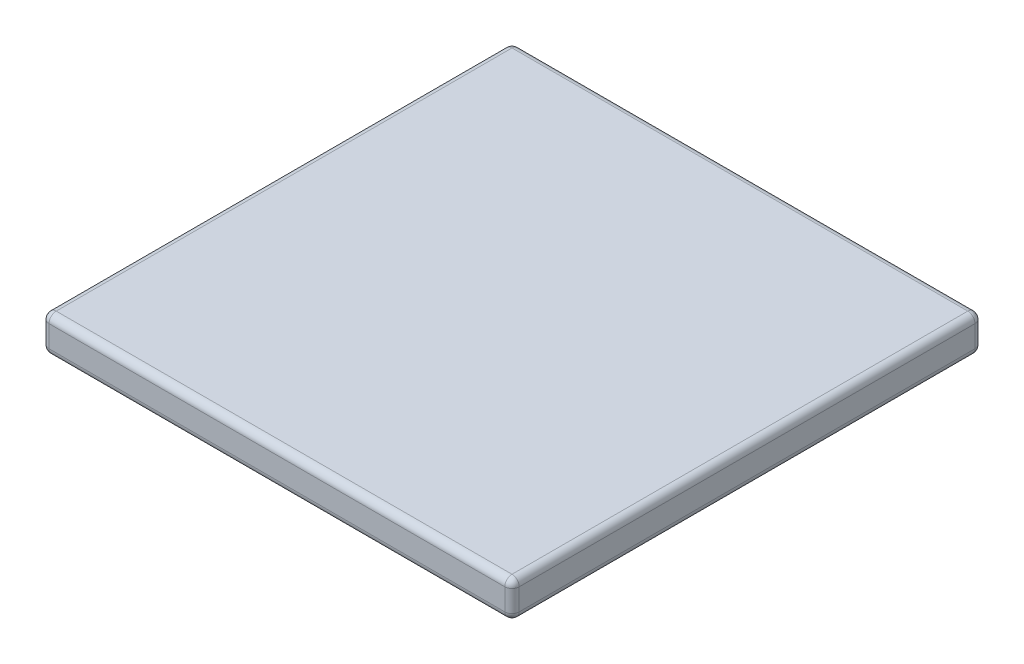
ISO-10303-21;
HEADER;
FILE_DESCRIPTION(('STEP AP214'),'2;1');
FILE_NAME('part.step','',(''),(''),'','','');
FILE_SCHEMA(('AUTOMOTIVE_DESIGN { 1 0 10303 214 1 1 1 1 }'));
ENDSEC;
DATA;
#1=APPLICATION_CONTEXT('core data for automotive mechanical design processes');
#2=APPLICATION_PROTOCOL_DEFINITION('international standard','automotive_design',2000,#1);
#3=PRODUCT_CONTEXT('',#1,'mechanical');
#4=PRODUCT('Part','Part','',(#3));
#5=PRODUCT_RELATED_PRODUCT_CATEGORY('part','',(#4));
#6=PRODUCT_DEFINITION_FORMATION('','',#4);
#7=PRODUCT_DEFINITION_CONTEXT('part definition',#1,'design');
#8=PRODUCT_DEFINITION('design','',#6,#7);
#9=PRODUCT_DEFINITION_SHAPE('','',#8);
#10=(LENGTH_UNIT() NAMED_UNIT(*) SI_UNIT(.MILLI.,.METRE.));
#11=(NAMED_UNIT(*) PLANE_ANGLE_UNIT() SI_UNIT($,.RADIAN.));
#12=(NAMED_UNIT(*) SI_UNIT($,.STERADIAN.) SOLID_ANGLE_UNIT());
#13=UNCERTAINTY_MEASURE_WITH_UNIT(LENGTH_MEASURE(1.E-05),#10,'distance_accuracy_value','');
#14=(GEOMETRIC_REPRESENTATION_CONTEXT(3) GLOBAL_UNCERTAINTY_ASSIGNED_CONTEXT((#13)) GLOBAL_UNIT_ASSIGNED_CONTEXT((#10,
#11,#12)) REPRESENTATION_CONTEXT('',''));
#15=CARTESIAN_POINT('',(0.,0.,0.));
#16=DIRECTION('',(0.,0.,1.));
#17=DIRECTION('',(1.,0.,0.));
#18=AXIS2_PLACEMENT_3D('',#15,#16,#17);
#19=CARTESIAN_POINT('',(-7.25,7.1,7.25));
#20=DIRECTION('',(0.,0.,-1.));
#21=DIRECTION('',(-1.,0.,0.));
#22=AXIS2_PLACEMENT_3D('',#19,#20,#21);
#23=PLANE('',#22);
#24=DIRECTION('',(1.,0.,0.));
#25=VECTOR('',#24,1.);
#26=CARTESIAN_POINT('',(-7.25,0.,7.25));
#27=LINE('',#26,#25);
#28=CARTESIAN_POINT('',(-7.25,0.,7.25));
#29=VERTEX_POINT('',#28);
#30=CARTESIAN_POINT('',(-5.75,0.,7.25));
#31=VERTEX_POINT('',#30);
#32=EDGE_CURVE('E191',#29,#31,#27,.T.);
#33=ORIENTED_EDGE('',*,*,#32,.T.);
#34=DIRECTION('',(0.,1.,0.));
#35=VECTOR('',#34,1.);
#36=CARTESIAN_POINT('',(-5.75,0.,7.25));
#37=LINE('',#36,#35);
#38=CARTESIAN_POINT('',(-5.75,7.1,7.25));
#39=VERTEX_POINT('',#38);
#40=EDGE_CURVE('E205',#31,#39,#37,.T.);
#41=ORIENTED_EDGE('',*,*,#40,.T.);
#42=DIRECTION('',(1.,0.,0.));
#43=VECTOR('',#42,1.);
#44=CARTESIAN_POINT('',(-7.25,7.1,7.25));
#45=LINE('',#44,#43);
#46=CARTESIAN_POINT('',(-7.25,7.1,7.25));
#47=VERTEX_POINT('',#46);
#48=EDGE_CURVE('E185',#47,#39,#45,.T.);
#49=ORIENTED_EDGE('',*,*,#48,.F.);
#50=DIRECTION('',(0.,-1.,0.));
#51=VECTOR('',#50,1.);
#52=CARTESIAN_POINT('',(-7.25,7.1,7.25));
#53=LINE('',#52,#51);
#54=EDGE_CURVE('E194',#47,#29,#53,.T.);
#55=ORIENTED_EDGE('',*,*,#54,.T.);
#56=EDGE_LOOP('',(#33,#41,#49,#55));
#57=FACE_BOUND('',#56,.T.);
#58=ADVANCED_FACE('F41',(#57),#23,.F.);
#59=CARTESIAN_POINT('',(-7.25,7.1,7.25));
#60=DIRECTION('',(-1.,0.,0.));
#61=DIRECTION('',(0.,0.,1.));
#62=AXIS2_PLACEMENT_3D('',#59,#60,#61);
#63=PLANE('',#62);
#64=DIRECTION('',(0.,0.,-1.));
#65=VECTOR('',#64,1.);
#66=CARTESIAN_POINT('',(-7.25,0.,7.25));
#67=LINE('',#66,#65);
#68=CARTESIAN_POINT('',(-7.25,0.,-7.25));
#69=VERTEX_POINT('',#68);
#70=EDGE_CURVE('E197',#29,#69,#67,.T.);
#71=ORIENTED_EDGE('',*,*,#70,.F.);
#72=ORIENTED_EDGE('',*,*,#54,.F.);
#73=DIRECTION('',(0.,0.,-1.));
#74=VECTOR('',#73,1.);
#75=CARTESIAN_POINT('',(-7.25,7.1,7.25));
#76=LINE('',#75,#74);
#77=CARTESIAN_POINT('',(-7.25,7.1,-7.25));
#78=VERTEX_POINT('',#77);
#79=EDGE_CURVE('E181',#47,#78,#76,.T.);
#80=ORIENTED_EDGE('',*,*,#79,.T.);
#81=DIRECTION('',(0.,-1.,0.));
#82=VECTOR('',#81,1.);
#83=CARTESIAN_POINT('',(-7.25,7.1,-7.25));
#84=LINE('',#83,#82);
#85=EDGE_CURVE('E206',#78,#69,#84,.T.);
#86=ORIENTED_EDGE('',*,*,#85,.T.);
#87=EDGE_LOOP('',(#71,#72,#80,#86));
#88=FACE_BOUND('',#87,.T.);
#89=ADVANCED_FACE('F195',(#88),#63,.T.);
#90=CARTESIAN_POINT('',(5.75,7.1,7.25));
#91=VERTEX_POINT('',#90);
#92=CARTESIAN_POINT('',(7.25,7.1,7.25));
#93=VERTEX_POINT('',#92);
#94=EDGE_CURVE('E207',#91,#93,#45,.T.);
#95=ORIENTED_EDGE('',*,*,#94,.F.);
#96=DIRECTION('',(0.,1.,0.));
#97=VECTOR('',#96,1.);
#98=CARTESIAN_POINT('',(5.75,0.,7.25));
#99=LINE('',#98,#97);
#100=CARTESIAN_POINT('',(5.75,0.,7.25));
#101=VERTEX_POINT('',#100);
#102=EDGE_CURVE('E457',#101,#91,#99,.T.);
#103=ORIENTED_EDGE('',*,*,#102,.F.);
#104=CARTESIAN_POINT('',(7.25,0.,7.25));
#105=VERTEX_POINT('',#104);
#106=EDGE_CURVE('E223',#101,#105,#27,.T.);
#107=ORIENTED_EDGE('',*,*,#106,.T.);
#108=DIRECTION('',(0.,-1.,0.));
#109=VECTOR('',#108,1.);
#110=CARTESIAN_POINT('',(7.25,7.1,7.25));
#111=LINE('',#110,#109);
#112=EDGE_CURVE('E202',#93,#105,#111,.T.);
#113=ORIENTED_EDGE('',*,*,#112,.F.);
#114=EDGE_LOOP('',(#95,#103,#107,#113));
#115=FACE_BOUND('',#114,.T.);
#116=ADVANCED_FACE('F438',(#115),#23,.F.);
#117=CARTESIAN_POINT('',(7.25,7.1,7.25));
#118=DIRECTION('',(-1.,0.,0.));
#119=DIRECTION('',(0.,0.,1.));
#120=AXIS2_PLACEMENT_3D('',#117,#118,#119);
#121=PLANE('',#120);
#122=DIRECTION('',(0.,0.,-1.));
#123=VECTOR('',#122,1.);
#124=CARTESIAN_POINT('',(7.25,0.,7.25));
#125=LINE('',#124,#123);
#126=CARTESIAN_POINT('',(7.25,0.,-7.25));
#127=VERTEX_POINT('',#126);
#128=EDGE_CURVE('E220',#105,#127,#125,.T.);
#129=ORIENTED_EDGE('',*,*,#128,.T.);
#130=DIRECTION('',(0.,-1.,0.));
#131=VECTOR('',#130,1.);
#132=CARTESIAN_POINT('',(7.25,7.1,-7.25));
#133=LINE('',#132,#131);
#134=CARTESIAN_POINT('',(7.25,7.1,-7.25));
#135=VERTEX_POINT('',#134);
#136=EDGE_CURVE('E209',#135,#127,#133,.T.);
#137=ORIENTED_EDGE('',*,*,#136,.F.);
#138=DIRECTION('',(0.,0.,-1.));
#139=VECTOR('',#138,1.);
#140=CARTESIAN_POINT('',(7.25,7.1,7.25));
#141=LINE('',#140,#139);
#142=EDGE_CURVE('E211',#93,#135,#141,.T.);
#143=ORIENTED_EDGE('',*,*,#142,.F.);
#144=ORIENTED_EDGE('',*,*,#112,.T.);
#145=EDGE_LOOP('',(#129,#137,#143,#144));
#146=FACE_BOUND('',#145,.T.);
#147=ADVANCED_FACE('F446',(#146),#121,.F.);
#148=CARTESIAN_POINT('',(-7.25,7.1,-7.25));
#149=DIRECTION('',(0.,0.,-1.));
#150=DIRECTION('',(-1.,0.,0.));
#151=AXIS2_PLACEMENT_3D('',#148,#149,#150);
#152=PLANE('',#151);
#153=DIRECTION('',(1.,0.,0.));
#154=VECTOR('',#153,1.);
#155=CARTESIAN_POINT('',(-7.25,0.,-7.25));
#156=LINE('',#155,#154);
#157=EDGE_CURVE('E216',#69,#127,#156,.T.);
#158=ORIENTED_EDGE('',*,*,#157,.F.);
#159=ORIENTED_EDGE('',*,*,#85,.F.);
#160=DIRECTION('',(1.,0.,0.));
#161=VECTOR('',#160,1.);
#162=CARTESIAN_POINT('',(-7.25,7.1,-7.25));
#163=LINE('',#162,#161);
#164=EDGE_CURVE('E188',#78,#135,#163,.T.);
#165=ORIENTED_EDGE('',*,*,#164,.T.);
#166=ORIENTED_EDGE('',*,*,#136,.T.);
#167=EDGE_LOOP('',(#158,#159,#165,#166));
#168=FACE_BOUND('',#167,.T.);
#169=ADVANCED_FACE('F451',(#168),#152,.T.);
#170=CARTESIAN_POINT('',(0.,0.,0.));
#171=DIRECTION('',(0.,-1.,0.));
#172=DIRECTION('',(0.,0.,-1.));
#173=AXIS2_PLACEMENT_3D('',#170,#171,#172);
#174=PLANE('',#173);
#175=CARTESIAN_POINT('',(0.,0.,-1.));
#176=DIRECTION('',(0.,-1.,0.));
#177=DIRECTION('',(0.,0.,-1.));
#178=AXIS2_PLACEMENT_3D('',#175,#176,#177);
#179=CIRCLE('',#178,4.7625);
#180=CARTESIAN_POINT('',(0.,0.,-5.7625));
#181=VERTEX_POINT('',#180);
#182=EDGE_CURVE('E320',#181,#181,#179,.T.);
#183=ORIENTED_EDGE('',*,*,#182,.F.);
#184=EDGE_LOOP('',(#183));
#185=FACE_BOUND('',#184,.T.);
#186=DIRECTION('',(0.,0.,1.));
#187=VECTOR('',#186,1.);
#188=CARTESIAN_POINT('',(-5.75,0.,7.25));
#189=LINE('',#188,#187);
#190=CARTESIAN_POINT('',(-5.75,0.,5.25));
#191=VERTEX_POINT('',#190);
#192=EDGE_CURVE('E487',#191,#31,#189,.T.);
#193=ORIENTED_EDGE('',*,*,#192,.T.);
#194=ORIENTED_EDGE('',*,*,#32,.F.);
#195=ORIENTED_EDGE('',*,*,#70,.T.);
#196=ORIENTED_EDGE('',*,*,#157,.T.);
#197=ORIENTED_EDGE('',*,*,#128,.F.);
#198=ORIENTED_EDGE('',*,*,#106,.F.);
#199=DIRECTION('',(0.,0.,-1.));
#200=VECTOR('',#199,1.);
#201=CARTESIAN_POINT('',(5.75,0.,7.25));
#202=LINE('',#201,#200);
#203=CARTESIAN_POINT('',(5.75,0.,5.25));
#204=VERTEX_POINT('',#203);
#205=EDGE_CURVE('E472',#101,#204,#202,.T.);
#206=ORIENTED_EDGE('',*,*,#205,.T.);
#207=DIRECTION('',(-1.,0.,0.));
#208=VECTOR('',#207,1.);
#209=CARTESIAN_POINT('',(-5.75,0.,5.25));
#210=LINE('',#209,#208);
#211=EDGE_CURVE('E476',#204,#191,#210,.T.);
#212=ORIENTED_EDGE('',*,*,#211,.T.);
#213=EDGE_LOOP('',(#193,#194,#195,#196,#197,#198,#206,#212));
#214=FACE_BOUND('',#213,.T.);
#215=ADVANCED_FACE('F484',(#185,#214),#174,.T.);
#216=CARTESIAN_POINT('',(-5.75,0.,7.25));
#217=DIRECTION('',(-1.,0.,0.));
#218=DIRECTION('',(0.,0.,1.));
#219=AXIS2_PLACEMENT_3D('',#216,#217,#218);
#220=PLANE('',#219);
#221=DIRECTION('',(0.,0.,1.));
#222=VECTOR('',#221,1.);
#223=CARTESIAN_POINT('',(-5.75,7.1,7.25));
#224=LINE('',#223,#222);
#225=CARTESIAN_POINT('',(-5.75,7.1,5.25));
#226=VERTEX_POINT('',#225);
#227=EDGE_CURVE('E468',#226,#39,#224,.T.);
#228=ORIENTED_EDGE('',*,*,#227,.T.);
#229=ORIENTED_EDGE('',*,*,#40,.F.);
#230=ORIENTED_EDGE('',*,*,#192,.F.);
#231=DIRECTION('',(0.,1.,0.));
#232=VECTOR('',#231,1.);
#233=CARTESIAN_POINT('',(-5.75,0.,5.25));
#234=LINE('',#233,#232);
#235=EDGE_CURVE('E217',#191,#226,#234,.T.);
#236=ORIENTED_EDGE('',*,*,#235,.T.);
#237=EDGE_LOOP('',(#228,#229,#230,#236));
#238=FACE_BOUND('',#237,.T.);
#239=ADVANCED_FACE('F498',(#238),#220,.F.);
#240=CARTESIAN_POINT('',(-5.75,0.,5.25));
#241=DIRECTION('',(0.,0.,-1.));
#242=DIRECTION('',(-1.,0.,0.));
#243=AXIS2_PLACEMENT_3D('',#240,#241,#242);
#244=PLANE('',#243);
#245=DIRECTION('',(-1.,0.,0.));
#246=VECTOR('',#245,1.);
#247=CARTESIAN_POINT('',(-5.75,7.1,5.25));
#248=LINE('',#247,#246);
#249=CARTESIAN_POINT('',(5.75,7.1,5.25));
#250=VERTEX_POINT('',#249);
#251=EDGE_CURVE('E464',#250,#226,#248,.T.);
#252=ORIENTED_EDGE('',*,*,#251,.T.);
#253=ORIENTED_EDGE('',*,*,#235,.F.);
#254=ORIENTED_EDGE('',*,*,#211,.F.);
#255=DIRECTION('',(0.,1.,0.));
#256=VECTOR('',#255,1.);
#257=CARTESIAN_POINT('',(5.75,0.,5.25));
#258=LINE('',#257,#256);
#259=EDGE_CURVE('E473',#204,#250,#258,.T.);
#260=ORIENTED_EDGE('',*,*,#259,.T.);
#261=EDGE_LOOP('',(#252,#253,#254,#260));
#262=FACE_BOUND('',#261,.T.);
#263=ADVANCED_FACE('F500',(#262),#244,.F.);
#264=CARTESIAN_POINT('',(5.75,0.,7.25));
#265=DIRECTION('',(1.,0.,0.));
#266=DIRECTION('',(0.,0.,-1.));
#267=AXIS2_PLACEMENT_3D('',#264,#265,#266);
#268=PLANE('',#267);
#269=DIRECTION('',(0.,0.,-1.));
#270=VECTOR('',#269,1.);
#271=CARTESIAN_POINT('',(5.75,7.1,7.25));
#272=LINE('',#271,#270);
#273=EDGE_CURVE('E462',#91,#250,#272,.T.);
#274=ORIENTED_EDGE('',*,*,#273,.T.);
#275=ORIENTED_EDGE('',*,*,#259,.F.);
#276=ORIENTED_EDGE('',*,*,#205,.F.);
#277=ORIENTED_EDGE('',*,*,#102,.T.);
#278=EDGE_LOOP('',(#274,#275,#276,#277));
#279=FACE_BOUND('',#278,.T.);
#280=ADVANCED_FACE('F470',(#279),#268,.F.);
#281=CARTESIAN_POINT('',(0.,-1.,-1.));
#282=DIRECTION('',(0.,1.,0.));
#283=DIRECTION('',(0.,0.,1.));
#284=AXIS2_PLACEMENT_3D('',#281,#282,#283);
#285=CYLINDRICAL_SURFACE('',#284,4.7625);
#286=CARTESIAN_POINT('',(0.,-1.,-1.));
#287=DIRECTION('',(0.,-1.,0.));
#288=DIRECTION('',(0.,0.,-1.));
#289=AXIS2_PLACEMENT_3D('',#286,#287,#288);
#290=CIRCLE('',#289,4.7625);
#291=CARTESIAN_POINT('',(0.,-1.,-5.7625));
#292=VERTEX_POINT('',#291);
#293=EDGE_CURVE('E497',#292,#292,#290,.T.);
#294=ORIENTED_EDGE('',*,*,#293,.F.);
#295=EDGE_LOOP('',(#294));
#296=FACE_BOUND('',#295,.T.);
#297=ORIENTED_EDGE('',*,*,#182,.T.);
#298=EDGE_LOOP('',(#297));
#299=FACE_BOUND('',#298,.T.);
#300=ADVANCED_FACE('F507',(#296,#299),#285,.T.);
#301=CARTESIAN_POINT('',(0.,-1.,-1.));
#302=DIRECTION('',(0.,-1.,0.));
#303=DIRECTION('',(0.,0.,-1.));
#304=AXIS2_PLACEMENT_3D('',#301,#302,#303);
#305=PLANE('',#304);
#306=ORIENTED_EDGE('',*,*,#293,.T.);
#307=EDGE_LOOP('',(#306));
#308=FACE_BOUND('',#307,.T.);
#309=ADVANCED_FACE('F524',(#308),#305,.T.);
#310=CARTESIAN_POINT('',(32.5,12.1,32.5));
#311=DIRECTION('',(-1.,0.,0.));
#312=DIRECTION('',(0.,0.,1.));
#313=AXIS2_PLACEMENT_3D('',#310,#311,#312);
#314=PLANE('',#313);
#315=DIRECTION('',(0.,-1.,0.));
#316=VECTOR('',#315,1.);
#317=CARTESIAN_POINT('',(32.5,12.1,-31.5));
#318=LINE('',#317,#316);
#319=CARTESIAN_POINT('',(32.5,8.1,-31.5));
#320=VERTEX_POINT('',#319);
#321=CARTESIAN_POINT('',(32.5,11.1,-31.5));
#322=VERTEX_POINT('',#321);
#323=EDGE_CURVE('E248',#320,#322,#318,.F.);
#324=ORIENTED_EDGE('',*,*,#323,.T.);
#325=DIRECTION('',(0.,0.,-1.));
#326=VECTOR('',#325,1.);
#327=CARTESIAN_POINT('',(32.5,11.1,32.5));
#328=LINE('',#327,#326);
#329=CARTESIAN_POINT('',(32.5,11.1,31.5));
#330=VERTEX_POINT('',#329);
#331=EDGE_CURVE('E284',#322,#330,#328,.F.);
#332=ORIENTED_EDGE('',*,*,#331,.T.);
#333=DIRECTION('',(0.,-1.,0.));
#334=VECTOR('',#333,1.);
#335=CARTESIAN_POINT('',(32.5,12.1,31.5));
#336=LINE('',#335,#334);
#337=CARTESIAN_POINT('',(32.5,8.1,31.5));
#338=VERTEX_POINT('',#337);
#339=EDGE_CURVE('E245',#330,#338,#336,.T.);
#340=ORIENTED_EDGE('',*,*,#339,.T.);
#341=DIRECTION('',(0.,0.,-1.));
#342=VECTOR('',#341,1.);
#343=CARTESIAN_POINT('',(32.5,8.1,-31.5));
#344=LINE('',#343,#342);
#345=EDGE_CURVE('E282',#338,#320,#344,.T.);
#346=ORIENTED_EDGE('',*,*,#345,.T.);
#347=EDGE_LOOP('',(#324,#332,#340,#346));
#348=FACE_BOUND('',#347,.T.);
#349=ADVANCED_FACE('F382',(#348),#314,.F.);
#350=CARTESIAN_POINT('',(-32.5,12.1,-32.5));
#351=DIRECTION('',(0.,0.,1.));
#352=DIRECTION('',(1.,0.,0.));
#353=AXIS2_PLACEMENT_3D('',#350,#351,#352);
#354=PLANE('',#353);
#355=DIRECTION('',(0.,-1.,0.));
#356=VECTOR('',#355,1.);
#357=CARTESIAN_POINT('',(-31.5,12.1,-32.5));
#358=LINE('',#357,#356);
#359=CARTESIAN_POINT('',(-31.5,8.1,-32.5));
#360=VERTEX_POINT('',#359);
#361=CARTESIAN_POINT('',(-31.5,11.1,-32.5));
#362=VERTEX_POINT('',#361);
#363=EDGE_CURVE('E242',#360,#362,#358,.F.);
#364=ORIENTED_EDGE('',*,*,#363,.T.);
#365=DIRECTION('',(-1.,0.,0.));
#366=VECTOR('',#365,1.);
#367=CARTESIAN_POINT('',(-32.5,11.1,-32.5));
#368=LINE('',#367,#366);
#369=CARTESIAN_POINT('',(31.5,11.1,-32.5));
#370=VERTEX_POINT('',#369);
#371=EDGE_CURVE('E276',#362,#370,#368,.F.);
#372=ORIENTED_EDGE('',*,*,#371,.T.);
#373=DIRECTION('',(0.,-1.,0.));
#374=VECTOR('',#373,1.);
#375=CARTESIAN_POINT('',(31.5,12.1,-32.5));
#376=LINE('',#375,#374);
#377=CARTESIAN_POINT('',(31.5,8.1,-32.5));
#378=VERTEX_POINT('',#377);
#379=EDGE_CURVE('E239',#370,#378,#376,.T.);
#380=ORIENTED_EDGE('',*,*,#379,.T.);
#381=DIRECTION('',(-1.,0.,0.));
#382=VECTOR('',#381,1.);
#383=CARTESIAN_POINT('',(-31.5,8.1,-32.5));
#384=LINE('',#383,#382);
#385=EDGE_CURVE('E274',#378,#360,#384,.T.);
#386=ORIENTED_EDGE('',*,*,#385,.T.);
#387=EDGE_LOOP('',(#364,#372,#380,#386));
#388=FACE_BOUND('',#387,.T.);
#389=ADVANCED_FACE('F353',(#388),#354,.F.);
#390=CARTESIAN_POINT('',(-32.5,12.1,32.5));
#391=DIRECTION('',(1.,0.,0.));
#392=DIRECTION('',(0.,0.,-1.));
#393=AXIS2_PLACEMENT_3D('',#390,#391,#392);
#394=PLANE('',#393);
#395=DIRECTION('',(0.,-1.,0.));
#396=VECTOR('',#395,1.);
#397=CARTESIAN_POINT('',(-32.5,12.1,31.5));
#398=LINE('',#397,#396);
#399=CARTESIAN_POINT('',(-32.5,8.1,31.5));
#400=VERTEX_POINT('',#399);
#401=CARTESIAN_POINT('',(-32.5,11.1,31.5));
#402=VERTEX_POINT('',#401);
#403=EDGE_CURVE('E236',#400,#402,#398,.F.);
#404=ORIENTED_EDGE('',*,*,#403,.T.);
#405=DIRECTION('',(0.,0.,1.));
#406=VECTOR('',#405,1.);
#407=CARTESIAN_POINT('',(-32.5,11.1,32.5));
#408=LINE('',#407,#406);
#409=CARTESIAN_POINT('',(-32.5,11.1,-31.5));
#410=VERTEX_POINT('',#409);
#411=EDGE_CURVE('E268',#402,#410,#408,.F.);
#412=ORIENTED_EDGE('',*,*,#411,.T.);
#413=DIRECTION('',(0.,-1.,0.));
#414=VECTOR('',#413,1.);
#415=CARTESIAN_POINT('',(-32.5,12.1,-31.5));
#416=LINE('',#415,#414);
#417=CARTESIAN_POINT('',(-32.5,8.1,-31.5));
#418=VERTEX_POINT('',#417);
#419=EDGE_CURVE('E233',#410,#418,#416,.T.);
#420=ORIENTED_EDGE('',*,*,#419,.T.);
#421=DIRECTION('',(0.,0.,1.));
#422=VECTOR('',#421,1.);
#423=CARTESIAN_POINT('',(-32.5,8.1,31.5));
#424=LINE('',#423,#422);
#425=EDGE_CURVE('E266',#418,#400,#424,.T.);
#426=ORIENTED_EDGE('',*,*,#425,.T.);
#427=EDGE_LOOP('',(#404,#412,#420,#426));
#428=FACE_BOUND('',#427,.T.);
#429=ADVANCED_FACE('F408',(#428),#394,.F.);
#430=CARTESIAN_POINT('',(-32.5,12.1,32.5));
#431=DIRECTION('',(0.,0.,-1.));
#432=DIRECTION('',(-1.,0.,0.));
#433=AXIS2_PLACEMENT_3D('',#430,#431,#432);
#434=PLANE('',#433);
#435=DIRECTION('',(0.,-1.,0.));
#436=VECTOR('',#435,1.);
#437=CARTESIAN_POINT('',(31.5,12.1,32.5));
#438=LINE('',#437,#436);
#439=CARTESIAN_POINT('',(31.5,8.1,32.5));
#440=VERTEX_POINT('',#439);
#441=CARTESIAN_POINT('',(31.5,11.1,32.5));
#442=VERTEX_POINT('',#441);
#443=EDGE_CURVE('E201',#440,#442,#438,.F.);
#444=ORIENTED_EDGE('',*,*,#443,.T.);
#445=DIRECTION('',(1.,0.,0.));
#446=VECTOR('',#445,1.);
#447=CARTESIAN_POINT('',(-32.5,11.1,32.5));
#448=LINE('',#447,#446);
#449=CARTESIAN_POINT('',(-31.5,11.1,32.5));
#450=VERTEX_POINT('',#449);
#451=EDGE_CURVE('E11',#442,#450,#448,.F.);
#452=ORIENTED_EDGE('',*,*,#451,.T.);
#453=DIRECTION('',(0.,-1.,0.));
#454=VECTOR('',#453,1.);
#455=CARTESIAN_POINT('',(-31.5,12.1,32.5));
#456=LINE('',#455,#454);
#457=CARTESIAN_POINT('',(-31.5,8.1,32.5));
#458=VERTEX_POINT('',#457);
#459=EDGE_CURVE('E230',#450,#458,#456,.T.);
#460=ORIENTED_EDGE('',*,*,#459,.T.);
#461=DIRECTION('',(1.,0.,0.));
#462=VECTOR('',#461,1.);
#463=CARTESIAN_POINT('',(31.5,8.1,32.5));
#464=LINE('',#463,#462);
#465=EDGE_CURVE('E50',#458,#440,#464,.T.);
#466=ORIENTED_EDGE('',*,*,#465,.T.);
#467=EDGE_LOOP('',(#444,#452,#460,#466));
#468=FACE_BOUND('',#467,.T.);
#469=ADVANCED_FACE('F398',(#468),#434,.F.);
#470=CARTESIAN_POINT('',(0.,12.1,0.));
#471=DIRECTION('',(0.,-1.,0.));
#472=DIRECTION('',(0.,0.,-1.));
#473=AXIS2_PLACEMENT_3D('',#470,#471,#472);
#474=PLANE('',#473);
#475=DIRECTION('',(-1.,0.,0.));
#476=VECTOR('',#475,1.);
#477=CARTESIAN_POINT('',(0.,12.1,-31.5));
#478=LINE('',#477,#476);
#479=CARTESIAN_POINT('',(31.5,12.1,-31.5));
#480=VERTEX_POINT('',#479);
#481=CARTESIAN_POINT('',(-31.5,12.1,-31.5));
#482=VERTEX_POINT('',#481);
#483=EDGE_CURVE('E261',#480,#482,#478,.T.);
#484=ORIENTED_EDGE('',*,*,#483,.T.);
#485=DIRECTION('',(0.,0.,1.));
#486=VECTOR('',#485,1.);
#487=CARTESIAN_POINT('',(-31.5,12.1,0.));
#488=LINE('',#487,#486);
#489=CARTESIAN_POINT('',(-31.5,12.1,31.5));
#490=VERTEX_POINT('',#489);
#491=EDGE_CURVE('E263',#482,#490,#488,.T.);
#492=ORIENTED_EDGE('',*,*,#491,.T.);
#493=DIRECTION('',(1.,0.,0.));
#494=VECTOR('',#493,1.);
#495=CARTESIAN_POINT('',(0.,12.1,31.5));
#496=LINE('',#495,#494);
#497=CARTESIAN_POINT('',(31.5,12.1,31.5));
#498=VERTEX_POINT('',#497);
#499=EDGE_CURVE('E257',#490,#498,#496,.T.);
#500=ORIENTED_EDGE('',*,*,#499,.T.);
#501=DIRECTION('',(0.,0.,-1.));
#502=VECTOR('',#501,1.);
#503=CARTESIAN_POINT('',(31.5,12.1,0.));
#504=LINE('',#503,#502);
#505=EDGE_CURVE('E259',#498,#480,#504,.T.);
#506=ORIENTED_EDGE('',*,*,#505,.T.);
#507=EDGE_LOOP('',(#484,#492,#500,#506));
#508=FACE_BOUND('',#507,.T.);
#509=ADVANCED_FACE('F372',(#508),#474,.F.);
#510=CARTESIAN_POINT('',(0.,7.1,0.));
#511=DIRECTION('',(0.,-1.,0.));
#512=DIRECTION('',(0.,0.,-1.));
#513=AXIS2_PLACEMENT_3D('',#510,#511,#512);
#514=PLANE('',#513);
#515=DIRECTION('',(1.,0.,0.));
#516=VECTOR('',#515,1.);
#517=CARTESIAN_POINT('',(-31.5,7.1,31.5));
#518=LINE('',#517,#516);
#519=CARTESIAN_POINT('',(31.5,7.1,31.5));
#520=VERTEX_POINT('',#519);
#521=CARTESIAN_POINT('',(-31.5,7.1,31.5));
#522=VERTEX_POINT('',#521);
#523=EDGE_CURVE('E290',#520,#522,#518,.F.);
#524=ORIENTED_EDGE('',*,*,#523,.T.);
#525=DIRECTION('',(0.,0.,1.));
#526=VECTOR('',#525,1.);
#527=CARTESIAN_POINT('',(-31.5,7.1,-31.5));
#528=LINE('',#527,#526);
#529=CARTESIAN_POINT('',(-31.5,7.1,-31.5));
#530=VERTEX_POINT('',#529);
#531=EDGE_CURVE('E295',#522,#530,#528,.F.);
#532=ORIENTED_EDGE('',*,*,#531,.T.);
#533=DIRECTION('',(-1.,0.,0.));
#534=VECTOR('',#533,1.);
#535=CARTESIAN_POINT('',(31.5,7.1,-31.5));
#536=LINE('',#535,#534);
#537=CARTESIAN_POINT('',(31.5,7.1,-31.5));
#538=VERTEX_POINT('',#537);
#539=EDGE_CURVE('E66',#530,#538,#536,.F.);
#540=ORIENTED_EDGE('',*,*,#539,.T.);
#541=DIRECTION('',(0.,0.,-1.));
#542=VECTOR('',#541,1.);
#543=CARTESIAN_POINT('',(31.5,7.1,31.5));
#544=LINE('',#543,#542);
#545=EDGE_CURVE('E292',#538,#520,#544,.F.);
#546=ORIENTED_EDGE('',*,*,#545,.T.);
#547=EDGE_LOOP('',(#524,#532,#540,#546));
#548=FACE_BOUND('',#547,.T.);
#549=ORIENTED_EDGE('',*,*,#79,.F.);
#550=ORIENTED_EDGE('',*,*,#48,.T.);
#551=ORIENTED_EDGE('',*,*,#227,.F.);
#552=ORIENTED_EDGE('',*,*,#251,.F.);
#553=ORIENTED_EDGE('',*,*,#273,.F.);
#554=ORIENTED_EDGE('',*,*,#94,.T.);
#555=ORIENTED_EDGE('',*,*,#142,.T.);
#556=ORIENTED_EDGE('',*,*,#164,.F.);
#557=EDGE_LOOP('',(#549,#550,#551,#552,#553,#554,#555,#556));
#558=FACE_BOUND('',#557,.T.);
#559=ADVANCED_FACE('F183',(#548,#558),#514,.T.);
#560=CARTESIAN_POINT('',(-31.5,12.1,31.5));
#561=DIRECTION('',(0.,-1.,0.));
#562=DIRECTION('',(0.,0.,-1.));
#563=AXIS2_PLACEMENT_3D('',#560,#561,#562);
#564=CYLINDRICAL_SURFACE('',#563,1.);
#565=ORIENTED_EDGE('',*,*,#459,.F.);
#566=CARTESIAN_POINT('',(-31.5,11.1,31.5));
#567=DIRECTION('',(0.,-1.,0.));
#568=DIRECTION('',(0.,0.,-1.));
#569=AXIS2_PLACEMENT_3D('',#566,#567,#568);
#570=CIRCLE('',#569,1.);
#571=EDGE_CURVE('E254',#450,#402,#570,.T.);
#572=ORIENTED_EDGE('',*,*,#571,.T.);
#573=ORIENTED_EDGE('',*,*,#403,.F.);
#574=CARTESIAN_POINT('',(-31.5,8.1,31.5));
#575=DIRECTION('',(0.,-1.,0.));
#576=DIRECTION('',(0.,0.,-1.));
#577=AXIS2_PLACEMENT_3D('',#574,#575,#576);
#578=CIRCLE('',#577,1.);
#579=EDGE_CURVE('E251',#400,#458,#578,.F.);
#580=ORIENTED_EDGE('',*,*,#579,.T.);
#581=EDGE_LOOP('',(#565,#572,#573,#580));
#582=FACE_BOUND('',#581,.T.);
#583=ADVANCED_FACE('F401',(#582),#564,.T.);
#584=CARTESIAN_POINT('',(-31.5,12.1,-31.5));
#585=DIRECTION('',(0.,-1.,0.));
#586=DIRECTION('',(0.,0.,-1.));
#587=AXIS2_PLACEMENT_3D('',#584,#585,#586);
#588=CYLINDRICAL_SURFACE('',#587,1.);
#589=ORIENTED_EDGE('',*,*,#419,.F.);
#590=CARTESIAN_POINT('',(-31.5,11.1,-31.5));
#591=DIRECTION('',(0.,-1.,0.));
#592=DIRECTION('',(0.,0.,-1.));
#593=AXIS2_PLACEMENT_3D('',#590,#591,#592);
#594=CIRCLE('',#593,1.);
#595=EDGE_CURVE('E272',#410,#362,#594,.T.);
#596=ORIENTED_EDGE('',*,*,#595,.T.);
#597=ORIENTED_EDGE('',*,*,#363,.F.);
#598=CARTESIAN_POINT('',(-31.5,8.1,-31.5));
#599=DIRECTION('',(0.,-1.,0.));
#600=DIRECTION('',(0.,0.,-1.));
#601=AXIS2_PLACEMENT_3D('',#598,#599,#600);
#602=CIRCLE('',#601,1.);
#603=EDGE_CURVE('E270',#360,#418,#602,.F.);
#604=ORIENTED_EDGE('',*,*,#603,.T.);
#605=EDGE_LOOP('',(#589,#596,#597,#604));
#606=FACE_BOUND('',#605,.T.);
#607=ADVANCED_FACE('F410',(#606),#588,.T.);
#608=CARTESIAN_POINT('',(31.5,12.1,-31.5));
#609=DIRECTION('',(0.,-1.,0.));
#610=DIRECTION('',(0.,0.,-1.));
#611=AXIS2_PLACEMENT_3D('',#608,#609,#610);
#612=CYLINDRICAL_SURFACE('',#611,1.);
#613=ORIENTED_EDGE('',*,*,#379,.F.);
#614=CARTESIAN_POINT('',(31.5,11.1,-31.5));
#615=DIRECTION('',(0.,-1.,0.));
#616=DIRECTION('',(0.,0.,-1.));
#617=AXIS2_PLACEMENT_3D('',#614,#615,#616);
#618=CIRCLE('',#617,1.);
#619=EDGE_CURVE('E280',#370,#322,#618,.T.);
#620=ORIENTED_EDGE('',*,*,#619,.T.);
#621=ORIENTED_EDGE('',*,*,#323,.F.);
#622=CARTESIAN_POINT('',(31.5,8.1,-31.5));
#623=DIRECTION('',(0.,-1.,0.));
#624=DIRECTION('',(0.,0.,-1.));
#625=AXIS2_PLACEMENT_3D('',#622,#623,#624);
#626=CIRCLE('',#625,1.);
#627=EDGE_CURVE('E278',#320,#378,#626,.F.);
#628=ORIENTED_EDGE('',*,*,#627,.T.);
#629=EDGE_LOOP('',(#613,#620,#621,#628));
#630=FACE_BOUND('',#629,.T.);
#631=ADVANCED_FACE('F350',(#630),#612,.T.);
#632=CARTESIAN_POINT('',(31.5,12.1,31.5));
#633=DIRECTION('',(0.,-1.,0.));
#634=DIRECTION('',(0.,0.,-1.));
#635=AXIS2_PLACEMENT_3D('',#632,#633,#634);
#636=CYLINDRICAL_SURFACE('',#635,1.);
#637=ORIENTED_EDGE('',*,*,#339,.F.);
#638=CARTESIAN_POINT('',(31.5,11.1,31.5));
#639=DIRECTION('',(0.,-1.,0.));
#640=DIRECTION('',(0.,0.,-1.));
#641=AXIS2_PLACEMENT_3D('',#638,#639,#640);
#642=CIRCLE('',#641,1.);
#643=EDGE_CURVE('E288',#330,#442,#642,.T.);
#644=ORIENTED_EDGE('',*,*,#643,.T.);
#645=ORIENTED_EDGE('',*,*,#443,.F.);
#646=CARTESIAN_POINT('',(31.5,8.1,31.5));
#647=DIRECTION('',(0.,-1.,0.));
#648=DIRECTION('',(0.,0.,-1.));
#649=AXIS2_PLACEMENT_3D('',#646,#647,#648);
#650=CIRCLE('',#649,1.);
#651=EDGE_CURVE('E286',#440,#338,#650,.F.);
#652=ORIENTED_EDGE('',*,*,#651,.T.);
#653=EDGE_LOOP('',(#637,#644,#645,#652));
#654=FACE_BOUND('',#653,.T.);
#655=ADVANCED_FACE('F385',(#654),#636,.T.);
#656=CARTESIAN_POINT('',(31.5,11.1,-31.5));
#657=DIRECTION('',(0.,-1.,0.));
#658=DIRECTION('',(0.,0.,-1.));
#659=AXIS2_PLACEMENT_3D('',#656,#657,#658);
#660=SPHERICAL_SURFACE('',#659,1.);
#661=CARTESIAN_POINT('',(31.5,11.1,-31.5));
#662=DIRECTION('',(0.,0.,1.));
#663=DIRECTION('',(1.,0.,0.));
#664=AXIS2_PLACEMENT_3D('',#661,#662,#663);
#665=CIRCLE('',#664,1.);
#666=EDGE_CURVE('E314',#322,#480,#665,.T.);
#667=ORIENTED_EDGE('',*,*,#666,.F.);
#668=ORIENTED_EDGE('',*,*,#619,.F.);
#669=CARTESIAN_POINT('',(31.5,11.1,-31.5));
#670=DIRECTION('',(-1.,0.,0.));
#671=DIRECTION('',(0.,0.,1.));
#672=AXIS2_PLACEMENT_3D('',#669,#670,#671);
#673=CIRCLE('',#672,1.);
#674=EDGE_CURVE('E317',#480,#370,#673,.T.);
#675=ORIENTED_EDGE('',*,*,#674,.F.);
#676=EDGE_LOOP('',(#667,#668,#675));
#677=FACE_BOUND('',#676,.T.);
#678=ADVANCED_FACE('F380',(#677),#660,.T.);
#679=CARTESIAN_POINT('',(0.,11.1,-31.5));
#680=DIRECTION('',(-1.,0.,0.));
#681=DIRECTION('',(0.,0.,1.));
#682=AXIS2_PLACEMENT_3D('',#679,#680,#681);
#683=CYLINDRICAL_SURFACE('',#682,1.);
#684=ORIENTED_EDGE('',*,*,#674,.T.);
#685=ORIENTED_EDGE('',*,*,#371,.F.);
#686=CARTESIAN_POINT('',(-31.5,11.1,-31.5));
#687=DIRECTION('',(-1.,0.,0.));
#688=DIRECTION('',(0.,0.,1.));
#689=AXIS2_PLACEMENT_3D('',#686,#687,#688);
#690=CIRCLE('',#689,1.);
#691=EDGE_CURVE('E311',#482,#362,#690,.T.);
#692=ORIENTED_EDGE('',*,*,#691,.F.);
#693=ORIENTED_EDGE('',*,*,#483,.F.);
#694=EDGE_LOOP('',(#684,#685,#692,#693));
#695=FACE_BOUND('',#694,.T.);
#696=ADVANCED_FACE('F358',(#695),#683,.T.);
#697=CARTESIAN_POINT('',(31.5,11.1,0.));
#698=DIRECTION('',(0.,0.,-1.));
#699=DIRECTION('',(-1.,0.,0.));
#700=AXIS2_PLACEMENT_3D('',#697,#698,#699);
#701=CYLINDRICAL_SURFACE('',#700,1.);
#702=ORIENTED_EDGE('',*,*,#666,.T.);
#703=ORIENTED_EDGE('',*,*,#505,.F.);
#704=CARTESIAN_POINT('',(31.5,11.1,31.5));
#705=DIRECTION('',(0.,0.,1.));
#706=DIRECTION('',(1.,0.,0.));
#707=AXIS2_PLACEMENT_3D('',#704,#705,#706);
#708=CIRCLE('',#707,1.);
#709=EDGE_CURVE('E308',#330,#498,#708,.T.);
#710=ORIENTED_EDGE('',*,*,#709,.F.);
#711=ORIENTED_EDGE('',*,*,#331,.F.);
#712=EDGE_LOOP('',(#702,#703,#710,#711));
#713=FACE_BOUND('',#712,.T.);
#714=ADVANCED_FACE('F378',(#713),#701,.T.);
#715=CARTESIAN_POINT('',(-31.5,11.1,-31.5));
#716=DIRECTION('',(0.,-1.,0.));
#717=DIRECTION('',(0.,0.,-1.));
#718=AXIS2_PLACEMENT_3D('',#715,#716,#717);
#719=SPHERICAL_SURFACE('',#718,1.);
#720=ORIENTED_EDGE('',*,*,#691,.T.);
#721=ORIENTED_EDGE('',*,*,#595,.F.);
#722=CARTESIAN_POINT('',(-31.5,11.1,-31.5));
#723=DIRECTION('',(0.,0.,1.));
#724=DIRECTION('',(1.,0.,0.));
#725=AXIS2_PLACEMENT_3D('',#722,#723,#724);
#726=CIRCLE('',#725,1.);
#727=EDGE_CURVE('E305',#482,#410,#726,.T.);
#728=ORIENTED_EDGE('',*,*,#727,.F.);
#729=EDGE_LOOP('',(#720,#721,#728));
#730=FACE_BOUND('',#729,.T.);
#731=ADVANCED_FACE('F364',(#730),#719,.T.);
#732=CARTESIAN_POINT('',(31.5,11.1,31.5));
#733=DIRECTION('',(0.,-1.,0.));
#734=DIRECTION('',(0.,0.,-1.));
#735=AXIS2_PLACEMENT_3D('',#732,#733,#734);
#736=SPHERICAL_SURFACE('',#735,1.);
#737=ORIENTED_EDGE('',*,*,#643,.F.);
#738=ORIENTED_EDGE('',*,*,#709,.T.);
#739=CARTESIAN_POINT('',(31.5,11.1,31.5));
#740=DIRECTION('',(-1.,0.,0.));
#741=DIRECTION('',(0.,0.,1.));
#742=AXIS2_PLACEMENT_3D('',#739,#740,#741);
#743=CIRCLE('',#742,1.);
#744=EDGE_CURVE('E302',#442,#498,#743,.T.);
#745=ORIENTED_EDGE('',*,*,#744,.F.);
#746=EDGE_LOOP('',(#737,#738,#745));
#747=FACE_BOUND('',#746,.T.);
#748=ADVANCED_FACE('F391',(#747),#736,.T.);
#749=CARTESIAN_POINT('',(-31.5,11.1,0.));
#750=DIRECTION('',(0.,0.,1.));
#751=DIRECTION('',(1.,0.,0.));
#752=AXIS2_PLACEMENT_3D('',#749,#750,#751);
#753=CYLINDRICAL_SURFACE('',#752,1.);
#754=ORIENTED_EDGE('',*,*,#727,.T.);
#755=ORIENTED_EDGE('',*,*,#411,.F.);
#756=CARTESIAN_POINT('',(-31.5,11.1,31.5));
#757=DIRECTION('',(0.,0.,1.));
#758=DIRECTION('',(1.,0.,0.));
#759=AXIS2_PLACEMENT_3D('',#756,#757,#758);
#760=CIRCLE('',#759,1.);
#761=EDGE_CURVE('E300',#490,#402,#760,.T.);
#762=ORIENTED_EDGE('',*,*,#761,.F.);
#763=ORIENTED_EDGE('',*,*,#491,.F.);
#764=EDGE_LOOP('',(#754,#755,#762,#763));
#765=FACE_BOUND('',#764,.T.);
#766=ADVANCED_FACE('F369',(#765),#753,.T.);
#767=CARTESIAN_POINT('',(0.,11.1,31.5));
#768=DIRECTION('',(1.,0.,0.));
#769=DIRECTION('',(0.,0.,-1.));
#770=AXIS2_PLACEMENT_3D('',#767,#768,#769);
#771=CYLINDRICAL_SURFACE('',#770,1.);
#772=ORIENTED_EDGE('',*,*,#744,.T.);
#773=ORIENTED_EDGE('',*,*,#499,.F.);
#774=CARTESIAN_POINT('',(-31.5,11.1,31.5));
#775=DIRECTION('',(-1.,0.,0.));
#776=DIRECTION('',(0.,0.,1.));
#777=AXIS2_PLACEMENT_3D('',#774,#775,#776);
#778=CIRCLE('',#777,1.);
#779=EDGE_CURVE('E298',#450,#490,#778,.T.);
#780=ORIENTED_EDGE('',*,*,#779,.F.);
#781=ORIENTED_EDGE('',*,*,#451,.F.);
#782=EDGE_LOOP('',(#772,#773,#780,#781));
#783=FACE_BOUND('',#782,.T.);
#784=ADVANCED_FACE('F395',(#783),#771,.T.);
#785=CARTESIAN_POINT('',(-31.5,11.1,31.5));
#786=DIRECTION('',(0.,-1.,0.));
#787=DIRECTION('',(0.,0.,-1.));
#788=AXIS2_PLACEMENT_3D('',#785,#786,#787);
#789=SPHERICAL_SURFACE('',#788,1.);
#790=ORIENTED_EDGE('',*,*,#761,.T.);
#791=ORIENTED_EDGE('',*,*,#571,.F.);
#792=ORIENTED_EDGE('',*,*,#779,.T.);
#793=EDGE_LOOP('',(#790,#791,#792));
#794=FACE_BOUND('',#793,.T.);
#795=ADVANCED_FACE('F405',(#794),#789,.T.);
#796=CARTESIAN_POINT('',(31.5,8.1,-31.5));
#797=DIRECTION('',(0.,-1.,0.));
#798=DIRECTION('',(0.,0.,-1.));
#799=AXIS2_PLACEMENT_3D('',#796,#797,#798);
#800=SPHERICAL_SURFACE('',#799,1.);
#801=CARTESIAN_POINT('',(31.5,8.1,-31.5));
#802=DIRECTION('',(-1.,0.,0.));
#803=DIRECTION('',(0.,0.,1.));
#804=AXIS2_PLACEMENT_3D('',#801,#802,#803);
#805=CIRCLE('',#804,1.);
#806=EDGE_CURVE('E334',#378,#538,#805,.T.);
#807=ORIENTED_EDGE('',*,*,#806,.F.);
#808=ORIENTED_EDGE('',*,*,#627,.F.);
#809=CARTESIAN_POINT('',(31.5,8.1,-31.5));
#810=DIRECTION('',(0.,0.,1.));
#811=DIRECTION('',(1.,0.,0.));
#812=AXIS2_PLACEMENT_3D('',#809,#810,#811);
#813=CIRCLE('',#812,1.);
#814=EDGE_CURVE('E45',#538,#320,#813,.T.);
#815=ORIENTED_EDGE('',*,*,#814,.F.);
#816=EDGE_LOOP('',(#807,#808,#815));
#817=FACE_BOUND('',#816,.T.);
#818=ADVANCED_FACE('F43',(#817),#800,.T.);
#819=CARTESIAN_POINT('',(31.5,8.1,32.5));
#820=DIRECTION('',(0.,0.,1.));
#821=DIRECTION('',(1.,0.,0.));
#822=AXIS2_PLACEMENT_3D('',#819,#820,#821);
#823=CYLINDRICAL_SURFACE('',#822,1.);
#824=ORIENTED_EDGE('',*,*,#814,.T.);
#825=ORIENTED_EDGE('',*,*,#345,.F.);
#826=CARTESIAN_POINT('',(31.5,8.1,31.5));
#827=DIRECTION('',(0.,0.,1.));
#828=DIRECTION('',(1.,0.,0.));
#829=AXIS2_PLACEMENT_3D('',#826,#827,#828);
#830=CIRCLE('',#829,1.);
#831=EDGE_CURVE('E332',#520,#338,#830,.T.);
#832=ORIENTED_EDGE('',*,*,#831,.F.);
#833=ORIENTED_EDGE('',*,*,#545,.F.);
#834=EDGE_LOOP('',(#824,#825,#832,#833));
#835=FACE_BOUND('',#834,.T.);
#836=ADVANCED_FACE('F343',(#835),#823,.T.);
#837=CARTESIAN_POINT('',(-32.5,8.1,-31.5));
#838=DIRECTION('',(1.,0.,0.));
#839=DIRECTION('',(0.,0.,-1.));
#840=AXIS2_PLACEMENT_3D('',#837,#838,#839);
#841=CYLINDRICAL_SURFACE('',#840,1.);
#842=ORIENTED_EDGE('',*,*,#806,.T.);
#843=ORIENTED_EDGE('',*,*,#539,.F.);
#844=CARTESIAN_POINT('',(-31.5,8.1,-31.5));
#845=DIRECTION('',(-1.,0.,0.));
#846=DIRECTION('',(0.,0.,1.));
#847=AXIS2_PLACEMENT_3D('',#844,#845,#846);
#848=CIRCLE('',#847,1.);
#849=EDGE_CURVE('E330',#360,#530,#848,.T.);
#850=ORIENTED_EDGE('',*,*,#849,.F.);
#851=ORIENTED_EDGE('',*,*,#385,.F.);
#852=EDGE_LOOP('',(#842,#843,#850,#851));
#853=FACE_BOUND('',#852,.T.);
#854=ADVANCED_FACE('F676',(#853),#841,.T.);
#855=CARTESIAN_POINT('',(31.5,8.1,31.5));
#856=DIRECTION('',(0.,-1.,0.));
#857=DIRECTION('',(0.,0.,-1.));
#858=AXIS2_PLACEMENT_3D('',#855,#856,#857);
#859=SPHERICAL_SURFACE('',#858,1.);
#860=ORIENTED_EDGE('',*,*,#831,.T.);
#861=ORIENTED_EDGE('',*,*,#651,.F.);
#862=CARTESIAN_POINT('',(31.5,8.1,31.5));
#863=DIRECTION('',(-1.,0.,0.));
#864=DIRECTION('',(0.,0.,1.));
#865=AXIS2_PLACEMENT_3D('',#862,#863,#864);
#866=CIRCLE('',#865,1.);
#867=EDGE_CURVE('E327',#520,#440,#866,.T.);
#868=ORIENTED_EDGE('',*,*,#867,.F.);
#869=EDGE_LOOP('',(#860,#861,#868));
#870=FACE_BOUND('',#869,.T.);
#871=ADVANCED_FACE('F426',(#870),#859,.T.);
#872=CARTESIAN_POINT('',(-31.5,8.1,-31.5));
#873=DIRECTION('',(0.,-1.,0.));
#874=DIRECTION('',(0.,0.,-1.));
#875=AXIS2_PLACEMENT_3D('',#872,#873,#874);
#876=SPHERICAL_SURFACE('',#875,1.);
#877=ORIENTED_EDGE('',*,*,#603,.F.);
#878=ORIENTED_EDGE('',*,*,#849,.T.);
#879=CARTESIAN_POINT('',(-31.5,8.1,-31.5));
#880=DIRECTION('',(0.,0.,1.));
#881=DIRECTION('',(1.,0.,0.));
#882=AXIS2_PLACEMENT_3D('',#879,#880,#881);
#883=CIRCLE('',#882,1.);
#884=EDGE_CURVE('E58',#418,#530,#883,.T.);
#885=ORIENTED_EDGE('',*,*,#884,.F.);
#886=EDGE_LOOP('',(#877,#878,#885));
#887=FACE_BOUND('',#886,.T.);
#888=ADVANCED_FACE('F414',(#887),#876,.T.);
#889=CARTESIAN_POINT('',(-32.5,8.1,31.5));
#890=DIRECTION('',(-1.,0.,0.));
#891=DIRECTION('',(0.,0.,1.));
#892=AXIS2_PLACEMENT_3D('',#889,#890,#891);
#893=CYLINDRICAL_SURFACE('',#892,1.);
#894=ORIENTED_EDGE('',*,*,#867,.T.);
#895=ORIENTED_EDGE('',*,*,#465,.F.);
#896=CARTESIAN_POINT('',(-31.5,8.1,31.5));
#897=DIRECTION('',(-1.,0.,0.));
#898=DIRECTION('',(0.,0.,1.));
#899=AXIS2_PLACEMENT_3D('',#896,#897,#898);
#900=CIRCLE('',#899,1.);
#901=EDGE_CURVE('E324',#522,#458,#900,.T.);
#902=ORIENTED_EDGE('',*,*,#901,.F.);
#903=ORIENTED_EDGE('',*,*,#523,.F.);
#904=EDGE_LOOP('',(#894,#895,#902,#903));
#905=FACE_BOUND('',#904,.T.);
#906=ADVANCED_FACE('F423',(#905),#893,.T.);
#907=CARTESIAN_POINT('',(-31.5,8.1,32.5));
#908=DIRECTION('',(0.,0.,-1.));
#909=DIRECTION('',(-1.,0.,0.));
#910=AXIS2_PLACEMENT_3D('',#907,#908,#909);
#911=CYLINDRICAL_SURFACE('',#910,1.);
#912=ORIENTED_EDGE('',*,*,#884,.T.);
#913=ORIENTED_EDGE('',*,*,#531,.F.);
#914=CARTESIAN_POINT('',(-31.5,8.1,31.5));
#915=DIRECTION('',(0.,0.,1.));
#916=DIRECTION('',(1.,0.,0.));
#917=AXIS2_PLACEMENT_3D('',#914,#915,#916);
#918=CIRCLE('',#917,1.);
#919=EDGE_CURVE('E321',#400,#522,#918,.T.);
#920=ORIENTED_EDGE('',*,*,#919,.F.);
#921=ORIENTED_EDGE('',*,*,#425,.F.);
#922=EDGE_LOOP('',(#912,#913,#920,#921));
#923=FACE_BOUND('',#922,.T.);
#924=ADVANCED_FACE('F416',(#923),#911,.T.);
#925=CARTESIAN_POINT('',(-31.5,8.1,31.5));
#926=DIRECTION('',(0.,-1.,0.));
#927=DIRECTION('',(0.,0.,-1.));
#928=AXIS2_PLACEMENT_3D('',#925,#926,#927);
#929=SPHERICAL_SURFACE('',#928,1.);
#930=ORIENTED_EDGE('',*,*,#901,.T.);
#931=ORIENTED_EDGE('',*,*,#579,.F.);
#932=ORIENTED_EDGE('',*,*,#919,.T.);
#933=EDGE_LOOP('',(#930,#931,#932));
#934=FACE_BOUND('',#933,.T.);
#935=ADVANCED_FACE('F418',(#934),#929,.T.);
#936=CLOSED_SHELL('',(#58,#89,#116,#147,#169,#215,#239,#263,#280,#300,#309,#349,#389,#429,#469,
#509,#559,#583,#607,#631,#655,#678,#696,#714,#731,#748,#766,#784,#795,#818,#836,#854,#871,#888,
#906,#924,#935));
#937=MANIFOLD_SOLID_BREP('B2',#936);
#938=ADVANCED_BREP_SHAPE_REPRESENTATION('',(#18,#937),#14);
#939=SHAPE_DEFINITION_REPRESENTATION(#9,#938);
ENDSEC;
END-ISO-10303-21;
